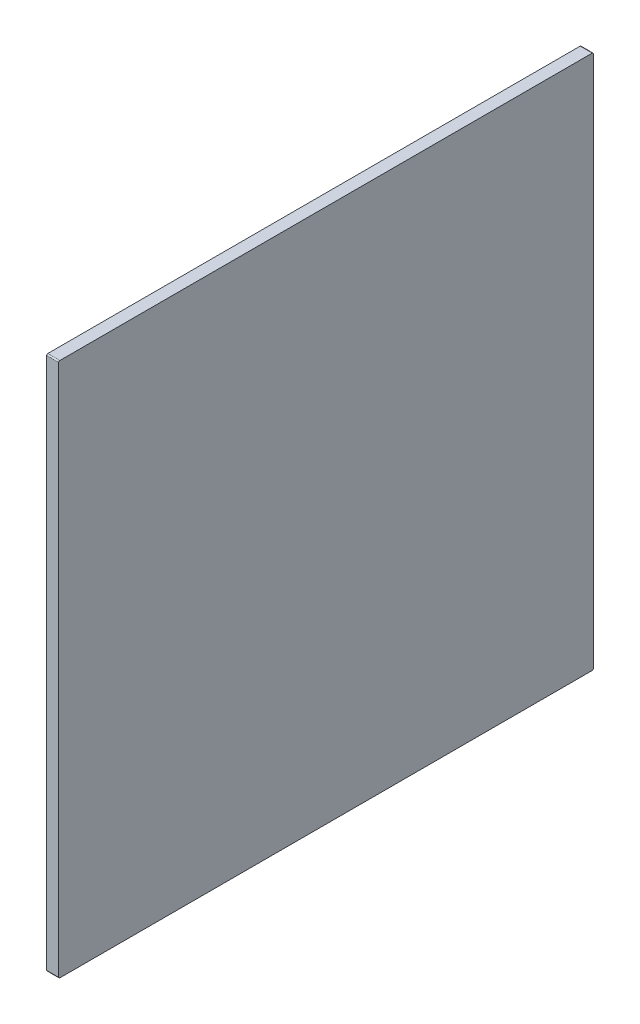
ISO-10303-21;
HEADER;
FILE_DESCRIPTION(('STEP AP214'),'2;1');
FILE_NAME('part.step','',(''),(''),'','','');
FILE_SCHEMA(('AUTOMOTIVE_DESIGN { 1 0 10303 214 1 1 1 1 }'));
ENDSEC;
DATA;
#1=APPLICATION_CONTEXT('core data for automotive mechanical design processes');
#2=APPLICATION_PROTOCOL_DEFINITION('international standard','automotive_design',2000,#1);
#3=PRODUCT_CONTEXT('',#1,'mechanical');
#4=PRODUCT('Part','Part','',(#3));
#5=PRODUCT_RELATED_PRODUCT_CATEGORY('part','',(#4));
#6=PRODUCT_DEFINITION_FORMATION('','',#4);
#7=PRODUCT_DEFINITION_CONTEXT('part definition',#1,'design');
#8=PRODUCT_DEFINITION('design','',#6,#7);
#9=PRODUCT_DEFINITION_SHAPE('','',#8);
#10=(LENGTH_UNIT() NAMED_UNIT(*) SI_UNIT(.MILLI.,.METRE.));
#11=(NAMED_UNIT(*) PLANE_ANGLE_UNIT() SI_UNIT($,.RADIAN.));
#12=(NAMED_UNIT(*) SI_UNIT($,.STERADIAN.) SOLID_ANGLE_UNIT());
#13=UNCERTAINTY_MEASURE_WITH_UNIT(LENGTH_MEASURE(1.E-05),#10,'distance_accuracy_value','');
#14=(GEOMETRIC_REPRESENTATION_CONTEXT(3) GLOBAL_UNCERTAINTY_ASSIGNED_CONTEXT((#13)) GLOBAL_UNIT_ASSIGNED_CONTEXT((#10,
#11,#12)) REPRESENTATION_CONTEXT('',''));
#15=CARTESIAN_POINT('',(0.,0.,0.));
#16=DIRECTION('',(0.,0.,1.));
#17=DIRECTION('',(1.,0.,0.));
#18=AXIS2_PLACEMENT_3D('',#15,#16,#17);
#19=CARTESIAN_POINT('',(-456.3,94.,393.5));
#20=DIRECTION('',(-1.,0.,0.));
#21=DIRECTION('',(0.,0.,1.));
#22=AXIS2_PLACEMENT_3D('',#19,#20,#21);
#23=CYLINDRICAL_SURFACE('',#22,0.199999999999992);
#24=CARTESIAN_POINT('',(-458.3,94.,393.5));
#25=DIRECTION('',(-1.,0.,0.));
#26=DIRECTION('',(0.,0.,1.));
#27=AXIS2_PLACEMENT_3D('',#24,#25,#26);
#28=CIRCLE('',#27,0.199999999999992);
#29=CARTESIAN_POINT('',(-458.3,94.2,393.5));
#30=VERTEX_POINT('',#29);
#31=CARTESIAN_POINT('',(-458.3,94.,393.3));
#32=VERTEX_POINT('',#31);
#33=EDGE_CURVE('E155',#30,#32,#28,.T.);
#34=ORIENTED_EDGE('',*,*,#33,.F.);
#35=DIRECTION('',(-1.,0.,0.));
#36=VECTOR('',#35,1.);
#37=CARTESIAN_POINT('',(-456.3,94.2,393.5));
#38=LINE('',#37,#36);
#39=CARTESIAN_POINT('',(-456.3,94.2,393.5));
#40=VERTEX_POINT('',#39);
#41=EDGE_CURVE('E12',#40,#30,#38,.T.);
#42=ORIENTED_EDGE('',*,*,#41,.F.);
#43=CARTESIAN_POINT('',(-456.3,94.,393.5));
#44=DIRECTION('',(-1.,0.,0.));
#45=DIRECTION('',(0.,0.,1.));
#46=AXIS2_PLACEMENT_3D('',#43,#44,#45);
#47=CIRCLE('',#46,0.199999999999992);
#48=CARTESIAN_POINT('',(-456.3,94.,393.3));
#49=VERTEX_POINT('',#48);
#50=EDGE_CURVE('E168',#40,#49,#47,.T.);
#51=ORIENTED_EDGE('',*,*,#50,.T.);
#52=DIRECTION('',(-1.,0.,0.));
#53=VECTOR('',#52,1.);
#54=CARTESIAN_POINT('',(-456.3,94.,393.3));
#55=LINE('',#54,#53);
#56=EDGE_CURVE('E48',#49,#32,#55,.T.);
#57=ORIENTED_EDGE('',*,*,#56,.T.);
#58=EDGE_LOOP('',(#34,#42,#51,#57));
#59=FACE_BOUND('',#58,.T.);
#60=ADVANCED_FACE('F45',(#59),#23,.T.);
#61=CARTESIAN_POINT('',(-456.3,94.2,481.5));
#62=DIRECTION('',(0.,1.,0.));
#63=DIRECTION('',(0.,0.,1.));
#64=AXIS2_PLACEMENT_3D('',#61,#62,#63);
#65=PLANE('',#64);
#66=DIRECTION('',(0.,0.,-1.));
#67=VECTOR('',#66,1.);
#68=CARTESIAN_POINT('',(-458.3,94.2,481.5));
#69=LINE('',#68,#67);
#70=CARTESIAN_POINT('',(-458.3,94.2,481.5));
#71=VERTEX_POINT('',#70);
#72=EDGE_CURVE('E172',#71,#30,#69,.T.);
#73=ORIENTED_EDGE('',*,*,#72,.F.);
#74=DIRECTION('',(-1.,0.,0.));
#75=VECTOR('',#74,1.);
#76=CARTESIAN_POINT('',(-456.3,94.2,481.5));
#77=LINE('',#76,#75);
#78=CARTESIAN_POINT('',(-456.3,94.2,481.5));
#79=VERTEX_POINT('',#78);
#80=EDGE_CURVE('E54',#79,#71,#77,.T.);
#81=ORIENTED_EDGE('',*,*,#80,.F.);
#82=DIRECTION('',(0.,0.,-1.));
#83=VECTOR('',#82,1.);
#84=CARTESIAN_POINT('',(-456.3,94.2,481.5));
#85=LINE('',#84,#83);
#86=EDGE_CURVE('E145',#79,#40,#85,.T.);
#87=ORIENTED_EDGE('',*,*,#86,.T.);
#88=ORIENTED_EDGE('',*,*,#41,.T.);
#89=EDGE_LOOP('',(#73,#81,#87,#88));
#90=FACE_BOUND('',#89,.T.);
#91=ADVANCED_FACE('F219',(#90),#65,.T.);
#92=CARTESIAN_POINT('',(-456.3,94.,481.5));
#93=DIRECTION('',(-1.,0.,0.));
#94=DIRECTION('',(0.,0.,1.));
#95=AXIS2_PLACEMENT_3D('',#92,#93,#94);
#96=CYLINDRICAL_SURFACE('',#95,0.199999999999992);
#97=CARTESIAN_POINT('',(-458.3,94.,481.5));
#98=DIRECTION('',(-1.,0.,0.));
#99=DIRECTION('',(0.,0.,1.));
#100=AXIS2_PLACEMENT_3D('',#97,#98,#99);
#101=CIRCLE('',#100,0.199999999999992);
#102=CARTESIAN_POINT('',(-458.3,94.,481.7));
#103=VERTEX_POINT('',#102);
#104=EDGE_CURVE('E132',#103,#71,#101,.T.);
#105=ORIENTED_EDGE('',*,*,#104,.F.);
#106=DIRECTION('',(-1.,0.,0.));
#107=VECTOR('',#106,1.);
#108=CARTESIAN_POINT('',(-456.3,94.,481.7));
#109=LINE('',#108,#107);
#110=CARTESIAN_POINT('',(-456.3,94.,481.7));
#111=VERTEX_POINT('',#110);
#112=EDGE_CURVE('E127',#111,#103,#109,.T.);
#113=ORIENTED_EDGE('',*,*,#112,.F.);
#114=CARTESIAN_POINT('',(-456.3,94.,481.5));
#115=DIRECTION('',(-1.,0.,0.));
#116=DIRECTION('',(0.,0.,1.));
#117=AXIS2_PLACEMENT_3D('',#114,#115,#116);
#118=CIRCLE('',#117,0.199999999999992);
#119=EDGE_CURVE('E130',#111,#79,#118,.T.);
#120=ORIENTED_EDGE('',*,*,#119,.T.);
#121=ORIENTED_EDGE('',*,*,#80,.T.);
#122=EDGE_LOOP('',(#105,#113,#120,#121));
#123=FACE_BOUND('',#122,.T.);
#124=ADVANCED_FACE('F129',(#123),#96,.T.);
#125=CARTESIAN_POINT('',(-456.3,6.,481.7));
#126=DIRECTION('',(0.,0.,1.));
#127=DIRECTION('',(1.,0.,0.));
#128=AXIS2_PLACEMENT_3D('',#125,#126,#127);
#129=PLANE('',#128);
#130=DIRECTION('',(0.,1.,0.));
#131=VECTOR('',#130,1.);
#132=CARTESIAN_POINT('',(-458.3,6.,481.7));
#133=LINE('',#132,#131);
#134=CARTESIAN_POINT('',(-458.3,6.,481.7));
#135=VERTEX_POINT('',#134);
#136=EDGE_CURVE('E200',#135,#103,#133,.T.);
#137=ORIENTED_EDGE('',*,*,#136,.F.);
#138=DIRECTION('',(-1.,0.,0.));
#139=VECTOR('',#138,1.);
#140=CARTESIAN_POINT('',(-456.3,6.,481.7));
#141=LINE('',#140,#139);
#142=CARTESIAN_POINT('',(-456.3,6.,481.7));
#143=VERTEX_POINT('',#142);
#144=EDGE_CURVE('E137',#143,#135,#141,.T.);
#145=ORIENTED_EDGE('',*,*,#144,.F.);
#146=DIRECTION('',(0.,1.,0.));
#147=VECTOR('',#146,1.);
#148=CARTESIAN_POINT('',(-456.3,6.,481.7));
#149=LINE('',#148,#147);
#150=EDGE_CURVE('E143',#143,#111,#149,.T.);
#151=ORIENTED_EDGE('',*,*,#150,.T.);
#152=ORIENTED_EDGE('',*,*,#112,.T.);
#153=EDGE_LOOP('',(#137,#145,#151,#152));
#154=FACE_BOUND('',#153,.T.);
#155=ADVANCED_FACE('F147',(#154),#129,.T.);
#156=CARTESIAN_POINT('',(-456.3,6.,481.5));
#157=DIRECTION('',(-1.,0.,0.));
#158=DIRECTION('',(0.,0.,1.));
#159=AXIS2_PLACEMENT_3D('',#156,#157,#158);
#160=CYLINDRICAL_SURFACE('',#159,0.199999999999987);
#161=CARTESIAN_POINT('',(-458.3,6.,481.5));
#162=DIRECTION('',(-1.,0.,0.));
#163=DIRECTION('',(0.,0.,1.));
#164=AXIS2_PLACEMENT_3D('',#161,#162,#163);
#165=CIRCLE('',#164,0.199999999999987);
#166=CARTESIAN_POINT('',(-458.3,5.80000000000001,481.5));
#167=VERTEX_POINT('',#166);
#168=EDGE_CURVE('E203',#167,#135,#165,.T.);
#169=ORIENTED_EDGE('',*,*,#168,.F.);
#170=DIRECTION('',(-1.,0.,0.));
#171=VECTOR('',#170,1.);
#172=CARTESIAN_POINT('',(-456.3,5.80000000000001,481.5));
#173=LINE('',#172,#171);
#174=CARTESIAN_POINT('',(-456.3,5.80000000000001,481.5));
#175=VERTEX_POINT('',#174);
#176=EDGE_CURVE('E181',#175,#167,#173,.T.);
#177=ORIENTED_EDGE('',*,*,#176,.F.);
#178=CARTESIAN_POINT('',(-456.3,6.,481.5));
#179=DIRECTION('',(-1.,0.,0.));
#180=DIRECTION('',(0.,0.,1.));
#181=AXIS2_PLACEMENT_3D('',#178,#179,#180);
#182=CIRCLE('',#181,0.199999999999987);
#183=EDGE_CURVE('E148',#175,#143,#182,.T.);
#184=ORIENTED_EDGE('',*,*,#183,.T.);
#185=ORIENTED_EDGE('',*,*,#144,.T.);
#186=EDGE_LOOP('',(#169,#177,#184,#185));
#187=FACE_BOUND('',#186,.T.);
#188=ADVANCED_FACE('F225',(#187),#160,.T.);
#189=CARTESIAN_POINT('',(-456.3,5.8,393.5));
#190=DIRECTION('',(0.,-1.,0.));
#191=DIRECTION('',(0.,0.,-1.));
#192=AXIS2_PLACEMENT_3D('',#189,#190,#191);
#193=PLANE('',#192);
#194=DIRECTION('',(0.,0.,1.));
#195=VECTOR('',#194,1.);
#196=CARTESIAN_POINT('',(-458.3,5.8,393.5));
#197=LINE('',#196,#195);
#198=CARTESIAN_POINT('',(-458.3,5.8,393.5));
#199=VERTEX_POINT('',#198);
#200=EDGE_CURVE('E205',#199,#167,#197,.T.);
#201=ORIENTED_EDGE('',*,*,#200,.F.);
#202=DIRECTION('',(-1.,0.,0.));
#203=VECTOR('',#202,1.);
#204=CARTESIAN_POINT('',(-456.3,5.8,393.5));
#205=LINE('',#204,#203);
#206=CARTESIAN_POINT('',(-456.3,5.8,393.5));
#207=VERTEX_POINT('',#206);
#208=EDGE_CURVE('E183',#207,#199,#205,.T.);
#209=ORIENTED_EDGE('',*,*,#208,.F.);
#210=DIRECTION('',(0.,0.,1.));
#211=VECTOR('',#210,1.);
#212=CARTESIAN_POINT('',(-456.3,5.8,393.5));
#213=LINE('',#212,#211);
#214=EDGE_CURVE('E150',#207,#175,#213,.T.);
#215=ORIENTED_EDGE('',*,*,#214,.T.);
#216=ORIENTED_EDGE('',*,*,#176,.T.);
#217=EDGE_LOOP('',(#201,#209,#215,#216));
#218=FACE_BOUND('',#217,.T.);
#219=ADVANCED_FACE('F180',(#218),#193,.T.);
#220=CARTESIAN_POINT('',(-456.3,6.,393.5));
#221=DIRECTION('',(-1.,0.,0.));
#222=DIRECTION('',(0.,0.,1.));
#223=AXIS2_PLACEMENT_3D('',#220,#221,#222);
#224=CYLINDRICAL_SURFACE('',#223,0.199999999999988);
#225=CARTESIAN_POINT('',(-458.3,6.,393.5));
#226=DIRECTION('',(-1.,0.,0.));
#227=DIRECTION('',(0.,0.,1.));
#228=AXIS2_PLACEMENT_3D('',#225,#226,#227);
#229=CIRCLE('',#228,0.199999999999988);
#230=CARTESIAN_POINT('',(-458.3,6.00000000000001,393.3));
#231=VERTEX_POINT('',#230);
#232=EDGE_CURVE('E190',#231,#199,#229,.T.);
#233=ORIENTED_EDGE('',*,*,#232,.F.);
#234=DIRECTION('',(-1.,0.,0.));
#235=VECTOR('',#234,1.);
#236=CARTESIAN_POINT('',(-456.3,6.00000000000001,393.3));
#237=LINE('',#236,#235);
#238=CARTESIAN_POINT('',(-456.3,6.00000000000001,393.3));
#239=VERTEX_POINT('',#238);
#240=EDGE_CURVE('E188',#239,#231,#237,.T.);
#241=ORIENTED_EDGE('',*,*,#240,.F.);
#242=CARTESIAN_POINT('',(-456.3,6.,393.5));
#243=DIRECTION('',(-1.,0.,0.));
#244=DIRECTION('',(0.,0.,1.));
#245=AXIS2_PLACEMENT_3D('',#242,#243,#244);
#246=CIRCLE('',#245,0.199999999999988);
#247=EDGE_CURVE('E174',#239,#207,#246,.T.);
#248=ORIENTED_EDGE('',*,*,#247,.T.);
#249=ORIENTED_EDGE('',*,*,#208,.T.);
#250=EDGE_LOOP('',(#233,#241,#248,#249));
#251=FACE_BOUND('',#250,.T.);
#252=ADVANCED_FACE('F187',(#251),#224,.T.);
#253=CARTESIAN_POINT('',(-456.3,94.,393.3));
#254=DIRECTION('',(0.,0.,-1.));
#255=DIRECTION('',(-1.,0.,0.));
#256=AXIS2_PLACEMENT_3D('',#253,#254,#255);
#257=PLANE('',#256);
#258=DIRECTION('',(0.,-1.,0.));
#259=VECTOR('',#258,1.);
#260=CARTESIAN_POINT('',(-458.3,94.,393.3));
#261=LINE('',#260,#259);
#262=EDGE_CURVE('E159',#32,#231,#261,.T.);
#263=ORIENTED_EDGE('',*,*,#262,.F.);
#264=ORIENTED_EDGE('',*,*,#56,.F.);
#265=DIRECTION('',(0.,-1.,0.));
#266=VECTOR('',#265,1.);
#267=CARTESIAN_POINT('',(-456.3,94.,393.3));
#268=LINE('',#267,#266);
#269=EDGE_CURVE('E171',#49,#239,#268,.T.);
#270=ORIENTED_EDGE('',*,*,#269,.T.);
#271=ORIENTED_EDGE('',*,*,#240,.T.);
#272=EDGE_LOOP('',(#263,#264,#270,#271));
#273=FACE_BOUND('',#272,.T.);
#274=ADVANCED_FACE('F210',(#273),#257,.T.);
#275=CARTESIAN_POINT('',(-456.3,94.,393.5));
#276=DIRECTION('',(-1.,0.,0.));
#277=DIRECTION('',(0.,0.,1.));
#278=AXIS2_PLACEMENT_3D('',#275,#276,#277);
#279=PLANE('',#278);
#280=ORIENTED_EDGE('',*,*,#50,.F.);
#281=ORIENTED_EDGE('',*,*,#86,.F.);
#282=ORIENTED_EDGE('',*,*,#119,.F.);
#283=ORIENTED_EDGE('',*,*,#150,.F.);
#284=ORIENTED_EDGE('',*,*,#183,.F.);
#285=ORIENTED_EDGE('',*,*,#214,.F.);
#286=ORIENTED_EDGE('',*,*,#247,.F.);
#287=ORIENTED_EDGE('',*,*,#269,.F.);
#288=EDGE_LOOP('',(#280,#281,#282,#283,#284,#285,#286,#287));
#289=FACE_BOUND('',#288,.T.);
#290=ADVANCED_FACE('F141',(#289),#279,.F.);
#291=CARTESIAN_POINT('',(-458.3,94.,393.5));
#292=DIRECTION('',(-1.,0.,0.));
#293=DIRECTION('',(0.,0.,1.));
#294=AXIS2_PLACEMENT_3D('',#291,#292,#293);
#295=PLANE('',#294);
#296=ORIENTED_EDGE('',*,*,#33,.T.);
#297=ORIENTED_EDGE('',*,*,#262,.T.);
#298=ORIENTED_EDGE('',*,*,#232,.T.);
#299=ORIENTED_EDGE('',*,*,#200,.T.);
#300=ORIENTED_EDGE('',*,*,#168,.T.);
#301=ORIENTED_EDGE('',*,*,#136,.T.);
#302=ORIENTED_EDGE('',*,*,#104,.T.);
#303=ORIENTED_EDGE('',*,*,#72,.T.);
#304=EDGE_LOOP('',(#296,#297,#298,#299,#300,#301,#302,#303));
#305=FACE_BOUND('',#304,.T.);
#306=ADVANCED_FACE('F209',(#305),#295,.T.);
#307=CLOSED_SHELL('',(#60,#91,#124,#155,#188,#219,#252,#274,#290,#306));
#308=MANIFOLD_SOLID_BREP('B2',#307);
#309=ADVANCED_BREP_SHAPE_REPRESENTATION('',(#18,#308),#14);
#310=SHAPE_DEFINITION_REPRESENTATION(#9,#309);
ENDSEC;
END-ISO-10303-21;
